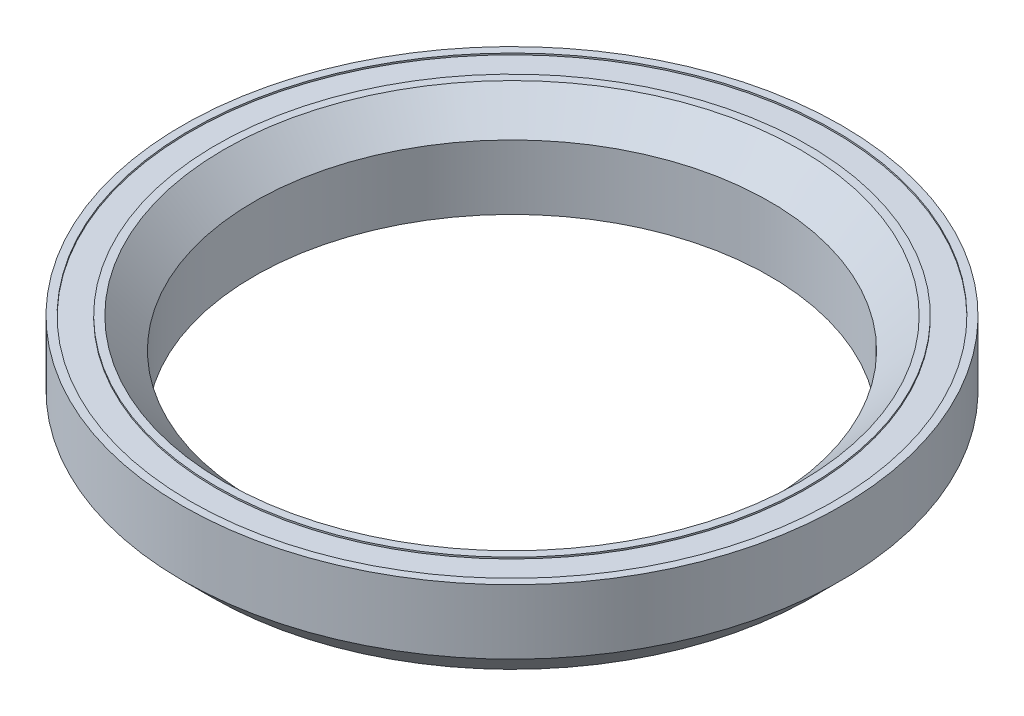
ISO-10303-21;
HEADER;
FILE_DESCRIPTION(('STEP AP214'),'2;1');
FILE_NAME('part.step','',(''),(''),'','','');
FILE_SCHEMA(('AUTOMOTIVE_DESIGN { 1 0 10303 214 1 1 1 1 }'));
ENDSEC;
DATA;
#1=APPLICATION_CONTEXT('core data for automotive mechanical design processes');
#2=APPLICATION_PROTOCOL_DEFINITION('international standard','automotive_design',2000,#1);
#3=PRODUCT_CONTEXT('',#1,'mechanical');
#4=PRODUCT('Part','Part','',(#3));
#5=PRODUCT_RELATED_PRODUCT_CATEGORY('part','',(#4));
#6=PRODUCT_DEFINITION_FORMATION('','',#4);
#7=PRODUCT_DEFINITION_CONTEXT('part definition',#1,'design');
#8=PRODUCT_DEFINITION('design','',#6,#7);
#9=PRODUCT_DEFINITION_SHAPE('','',#8);
#10=(LENGTH_UNIT() NAMED_UNIT(*) SI_UNIT(.MILLI.,.METRE.));
#11=(NAMED_UNIT(*) PLANE_ANGLE_UNIT() SI_UNIT($,.RADIAN.));
#12=(NAMED_UNIT(*) SI_UNIT($,.STERADIAN.) SOLID_ANGLE_UNIT());
#13=UNCERTAINTY_MEASURE_WITH_UNIT(LENGTH_MEASURE(1.E-05),#10,'distance_accuracy_value','');
#14=(GEOMETRIC_REPRESENTATION_CONTEXT(3) GLOBAL_UNCERTAINTY_ASSIGNED_CONTEXT((#13)) GLOBAL_UNIT_ASSIGNED_CONTEXT((#10,
#11,#12)) REPRESENTATION_CONTEXT('',''));
#15=CARTESIAN_POINT('',(0.,0.,0.));
#16=DIRECTION('',(0.,0.,1.));
#17=DIRECTION('',(1.,0.,0.));
#18=AXIS2_PLACEMENT_3D('',#15,#16,#17);
#19=CARTESIAN_POINT('',(0.,0.,16.35));
#20=DIRECTION('',(0.,-1.,0.));
#21=DIRECTION('',(0.,0.,-1.));
#22=AXIS2_PLACEMENT_3D('',#19,#20,#21);
#23=PLANE('',#22);
#24=CARTESIAN_POINT('',(0.,0.,0.));
#25=DIRECTION('',(0.,1.,0.));
#26=DIRECTION('',(0.,0.,1.));
#27=AXIS2_PLACEMENT_3D('',#24,#25,#26);
#28=CIRCLE('',#27,16.35);
#29=CARTESIAN_POINT('',(0.,0.,16.35));
#30=VERTEX_POINT('',#29);
#31=EDGE_CURVE('E54',#30,#30,#28,.T.);
#32=ORIENTED_EDGE('',*,*,#31,.T.);
#33=EDGE_LOOP('',(#32));
#34=FACE_BOUND('',#33,.T.);
#35=CARTESIAN_POINT('',(0.,0.,0.));
#36=DIRECTION('',(0.,-1.,0.));
#37=DIRECTION('',(0.,0.,-1.));
#38=AXIS2_PLACEMENT_3D('',#35,#36,#37);
#39=CIRCLE('',#38,16.85);
#40=CARTESIAN_POINT('',(0.,0.,-16.85));
#41=VERTEX_POINT('',#40);
#42=EDGE_CURVE('E79',#41,#41,#39,.T.);
#43=ORIENTED_EDGE('',*,*,#42,.T.);
#44=EDGE_LOOP('',(#43));
#45=FACE_BOUND('',#44,.T.);
#46=ADVANCED_FACE('F34',(#34,#45),#23,.T.);
#47=CARTESIAN_POINT('',(0.,6.,20.9));
#48=DIRECTION('',(0.,1.,0.));
#49=DIRECTION('',(0.,0.,1.));
#50=AXIS2_PLACEMENT_3D('',#47,#48,#49);
#51=PLANE('',#50);
#52=CARTESIAN_POINT('',(0.,6.,0.));
#53=DIRECTION('',(0.,1.,0.));
#54=DIRECTION('',(0.,0.,1.));
#55=AXIS2_PLACEMENT_3D('',#52,#53,#54);
#56=CIRCLE('',#55,18.26);
#57=CARTESIAN_POINT('',(0.,6.,18.26));
#58=VERTEX_POINT('',#57);
#59=EDGE_CURVE('E45',#58,#58,#56,.T.);
#60=ORIENTED_EDGE('',*,*,#59,.F.);
#61=EDGE_LOOP('',(#60));
#62=FACE_BOUND('',#61,.T.);
#63=CARTESIAN_POINT('',(0.,6.,0.));
#64=DIRECTION('',(0.,1.,0.));
#65=DIRECTION('',(0.,0.,1.));
#66=AXIS2_PLACEMENT_3D('',#63,#64,#65);
#67=CIRCLE('',#66,18.76);
#68=CARTESIAN_POINT('',(0.,6.,18.76));
#69=VERTEX_POINT('',#68);
#70=EDGE_CURVE('E67',#69,#69,#67,.T.);
#71=ORIENTED_EDGE('',*,*,#70,.T.);
#72=EDGE_LOOP('',(#71));
#73=FACE_BOUND('',#72,.T.);
#74=ADVANCED_FACE('F112',(#62,#73),#51,.T.);
#75=CARTESIAN_POINT('',(0.,1.91,0.));
#76=DIRECTION('',(0.,1.,0.));
#77=DIRECTION('',(0.,0.,1.));
#78=AXIS2_PLACEMENT_3D('',#75,#76,#77);
#79=CONICAL_SURFACE('',#78,20.9,0.785398163397447);
#80=CARTESIAN_POINT('',(0.,0.,0.));
#81=DIRECTION('',(0.,1.,0.));
#82=DIRECTION('',(0.,0.,1.));
#83=AXIS2_PLACEMENT_3D('',#80,#81,#82);
#84=CIRCLE('',#83,18.99);
#85=CARTESIAN_POINT('',(0.,0.,18.99));
#86=VERTEX_POINT('',#85);
#87=EDGE_CURVE('E57',#86,#86,#84,.T.);
#88=ORIENTED_EDGE('',*,*,#87,.T.);
#89=EDGE_LOOP('',(#88));
#90=FACE_BOUND('',#89,.T.);
#91=CARTESIAN_POINT('',(0.,1.91,0.));
#92=DIRECTION('',(0.,1.,0.));
#93=DIRECTION('',(0.,0.,1.));
#94=AXIS2_PLACEMENT_3D('',#91,#92,#93);
#95=CIRCLE('',#94,20.9);
#96=CARTESIAN_POINT('',(0.,1.91,20.9));
#97=VERTEX_POINT('',#96);
#98=EDGE_CURVE('E10',#97,#97,#95,.T.);
#99=ORIENTED_EDGE('',*,*,#98,.F.);
#100=EDGE_LOOP('',(#99));
#101=FACE_BOUND('',#100,.T.);
#102=ADVANCED_FACE('F36',(#90,#101),#79,.T.);
#103=CARTESIAN_POINT('',(0.,0.,0.));
#104=DIRECTION('',(0.,1.,0.));
#105=DIRECTION('',(0.,0.,1.));
#106=AXIS2_PLACEMENT_3D('',#103,#104,#105);
#107=CYLINDRICAL_SURFACE('',#106,20.9);
#108=ORIENTED_EDGE('',*,*,#98,.T.);
#109=EDGE_LOOP('',(#108));
#110=FACE_BOUND('',#109,.T.);
#111=CARTESIAN_POINT('',(0.,6.,0.));
#112=DIRECTION('',(0.,1.,0.));
#113=DIRECTION('',(0.,0.,1.));
#114=AXIS2_PLACEMENT_3D('',#111,#112,#113);
#115=CIRCLE('',#114,20.9);
#116=CARTESIAN_POINT('',(0.,6.,20.9));
#117=VERTEX_POINT('',#116);
#118=EDGE_CURVE('E41',#117,#117,#115,.T.);
#119=ORIENTED_EDGE('',*,*,#118,.F.);
#120=EDGE_LOOP('',(#119));
#121=FACE_BOUND('',#120,.T.);
#122=ADVANCED_FACE('F111',(#110,#121),#107,.T.);
#123=CARTESIAN_POINT('',(0.,6.,0.));
#124=DIRECTION('',(0.,1.,0.));
#125=DIRECTION('',(0.,0.,1.));
#126=AXIS2_PLACEMENT_3D('',#123,#124,#125);
#127=CIRCLE('',#126,20.4);
#128=CARTESIAN_POINT('',(0.,6.,20.4));
#129=VERTEX_POINT('',#128);
#130=EDGE_CURVE('E61',#129,#129,#127,.T.);
#131=ORIENTED_EDGE('',*,*,#130,.F.);
#132=EDGE_LOOP('',(#131));
#133=FACE_BOUND('',#132,.T.);
#134=ORIENTED_EDGE('',*,*,#118,.T.);
#135=EDGE_LOOP('',(#134));
#136=FACE_BOUND('',#135,.T.);
#137=ADVANCED_FACE('F117',(#133,#136),#51,.T.);
#138=CARTESIAN_POINT('',(0.,4.09,0.));
#139=DIRECTION('',(0.,1.,0.));
#140=DIRECTION('',(0.,0.,1.));
#141=AXIS2_PLACEMENT_3D('',#138,#139,#140);
#142=CONICAL_SURFACE('',#141,16.35,0.785398163397447);
#143=ORIENTED_EDGE('',*,*,#59,.T.);
#144=EDGE_LOOP('',(#143));
#145=FACE_BOUND('',#144,.T.);
#146=CARTESIAN_POINT('',(0.,4.09,0.));
#147=DIRECTION('',(0.,1.,0.));
#148=DIRECTION('',(0.,0.,1.));
#149=AXIS2_PLACEMENT_3D('',#146,#147,#148);
#150=CIRCLE('',#149,16.35);
#151=CARTESIAN_POINT('',(0.,4.09,16.35));
#152=VERTEX_POINT('',#151);
#153=EDGE_CURVE('E49',#152,#152,#150,.T.);
#154=ORIENTED_EDGE('',*,*,#153,.F.);
#155=EDGE_LOOP('',(#154));
#156=FACE_BOUND('',#155,.T.);
#157=ADVANCED_FACE('F130',(#145,#156),#142,.F.);
#158=CARTESIAN_POINT('',(0.,0.,0.));
#159=DIRECTION('',(0.,1.,0.));
#160=DIRECTION('',(0.,0.,1.));
#161=AXIS2_PLACEMENT_3D('',#158,#159,#160);
#162=CYLINDRICAL_SURFACE('',#161,16.35);
#163=ORIENTED_EDGE('',*,*,#153,.T.);
#164=EDGE_LOOP('',(#163));
#165=FACE_BOUND('',#164,.T.);
#166=ORIENTED_EDGE('',*,*,#31,.F.);
#167=EDGE_LOOP('',(#166));
#168=FACE_BOUND('',#167,.T.);
#169=ADVANCED_FACE('F105',(#165,#168),#162,.F.);
#170=CARTESIAN_POINT('',(0.,0.,0.));
#171=DIRECTION('',(0.,-1.,0.));
#172=DIRECTION('',(0.,0.,-1.));
#173=AXIS2_PLACEMENT_3D('',#170,#171,#172);
#174=CIRCLE('',#173,18.49);
#175=CARTESIAN_POINT('',(0.,0.,-18.49));
#176=VERTEX_POINT('',#175);
#177=EDGE_CURVE('E73',#176,#176,#174,.T.);
#178=ORIENTED_EDGE('',*,*,#177,.F.);
#179=EDGE_LOOP('',(#178));
#180=FACE_BOUND('',#179,.T.);
#181=ORIENTED_EDGE('',*,*,#87,.F.);
#182=EDGE_LOOP('',(#181));
#183=FACE_BOUND('',#182,.T.);
#184=ADVANCED_FACE('F101',(#180,#183),#23,.T.);
#185=CARTESIAN_POINT('',(0.,5.9,0.));
#186=DIRECTION('',(0.,1.,0.));
#187=DIRECTION('',(0.,0.,1.));
#188=AXIS2_PLACEMENT_3D('',#185,#186,#187);
#189=CYLINDRICAL_SURFACE('',#188,20.4);
#190=CARTESIAN_POINT('',(0.,5.9,0.));
#191=DIRECTION('',(0.,1.,0.));
#192=DIRECTION('',(0.,0.,1.));
#193=AXIS2_PLACEMENT_3D('',#190,#191,#192);
#194=CIRCLE('',#193,20.4);
#195=CARTESIAN_POINT('',(0.,5.9,20.4));
#196=VERTEX_POINT('',#195);
#197=EDGE_CURVE('E60',#196,#196,#194,.T.);
#198=ORIENTED_EDGE('',*,*,#197,.F.);
#199=EDGE_LOOP('',(#198));
#200=FACE_BOUND('',#199,.T.);
#201=ORIENTED_EDGE('',*,*,#130,.T.);
#202=EDGE_LOOP('',(#201));
#203=FACE_BOUND('',#202,.T.);
#204=ADVANCED_FACE('F104',(#200,#203),#189,.F.);
#205=CARTESIAN_POINT('',(0.,5.9,0.));
#206=DIRECTION('',(0.,1.,0.));
#207=DIRECTION('',(0.,0.,1.));
#208=AXIS2_PLACEMENT_3D('',#205,#206,#207);
#209=PLANE('',#208);
#210=CARTESIAN_POINT('',(0.,5.9,0.));
#211=DIRECTION('',(0.,1.,0.));
#212=DIRECTION('',(0.,0.,1.));
#213=AXIS2_PLACEMENT_3D('',#210,#211,#212);
#214=CIRCLE('',#213,18.76);
#215=CARTESIAN_POINT('',(0.,5.9,18.76));
#216=VERTEX_POINT('',#215);
#217=EDGE_CURVE('E64',#216,#216,#214,.T.);
#218=ORIENTED_EDGE('',*,*,#217,.F.);
#219=EDGE_LOOP('',(#218));
#220=FACE_BOUND('',#219,.T.);
#221=ORIENTED_EDGE('',*,*,#197,.T.);
#222=EDGE_LOOP('',(#221));
#223=FACE_BOUND('',#222,.T.);
#224=ADVANCED_FACE('F141',(#220,#223),#209,.T.);
#225=CARTESIAN_POINT('',(0.,5.9,0.));
#226=DIRECTION('',(0.,1.,0.));
#227=DIRECTION('',(0.,0.,1.));
#228=AXIS2_PLACEMENT_3D('',#225,#226,#227);
#229=CYLINDRICAL_SURFACE('',#228,18.76);
#230=ORIENTED_EDGE('',*,*,#217,.T.);
#231=EDGE_LOOP('',(#230));
#232=FACE_BOUND('',#231,.T.);
#233=ORIENTED_EDGE('',*,*,#70,.F.);
#234=EDGE_LOOP('',(#233));
#235=FACE_BOUND('',#234,.T.);
#236=ADVANCED_FACE('F97',(#232,#235),#229,.T.);
#237=CARTESIAN_POINT('',(0.,0.1,0.));
#238=DIRECTION('',(0.,-1.,0.));
#239=DIRECTION('',(0.,0.,-1.));
#240=AXIS2_PLACEMENT_3D('',#237,#238,#239);
#241=CYLINDRICAL_SURFACE('',#240,18.49);
#242=CARTESIAN_POINT('',(0.,0.1,0.));
#243=DIRECTION('',(0.,-1.,0.));
#244=DIRECTION('',(0.,0.,-1.));
#245=AXIS2_PLACEMENT_3D('',#242,#243,#244);
#246=CIRCLE('',#245,18.49);
#247=CARTESIAN_POINT('',(0.,0.1,-18.49));
#248=VERTEX_POINT('',#247);
#249=EDGE_CURVE('E70',#248,#248,#246,.T.);
#250=ORIENTED_EDGE('',*,*,#249,.F.);
#251=EDGE_LOOP('',(#250));
#252=FACE_BOUND('',#251,.T.);
#253=ORIENTED_EDGE('',*,*,#177,.T.);
#254=EDGE_LOOP('',(#253));
#255=FACE_BOUND('',#254,.T.);
#256=ADVANCED_FACE('F91',(#252,#255),#241,.F.);
#257=CARTESIAN_POINT('',(0.,0.1,0.));
#258=DIRECTION('',(0.,-1.,0.));
#259=DIRECTION('',(0.,0.,-1.));
#260=AXIS2_PLACEMENT_3D('',#257,#258,#259);
#261=PLANE('',#260);
#262=CARTESIAN_POINT('',(0.,0.1,0.));
#263=DIRECTION('',(0.,-1.,0.));
#264=DIRECTION('',(0.,0.,-1.));
#265=AXIS2_PLACEMENT_3D('',#262,#263,#264);
#266=CIRCLE('',#265,16.85);
#267=CARTESIAN_POINT('',(0.,0.1,-16.85));
#268=VERTEX_POINT('',#267);
#269=EDGE_CURVE('E76',#268,#268,#266,.T.);
#270=ORIENTED_EDGE('',*,*,#269,.F.);
#271=EDGE_LOOP('',(#270));
#272=FACE_BOUND('',#271,.T.);
#273=ORIENTED_EDGE('',*,*,#249,.T.);
#274=EDGE_LOOP('',(#273));
#275=FACE_BOUND('',#274,.T.);
#276=ADVANCED_FACE('F88',(#272,#275),#261,.T.);
#277=CARTESIAN_POINT('',(0.,0.1,0.));
#278=DIRECTION('',(0.,-1.,0.));
#279=DIRECTION('',(0.,0.,-1.));
#280=AXIS2_PLACEMENT_3D('',#277,#278,#279);
#281=CYLINDRICAL_SURFACE('',#280,16.85);
#282=ORIENTED_EDGE('',*,*,#269,.T.);
#283=EDGE_LOOP('',(#282));
#284=FACE_BOUND('',#283,.T.);
#285=ORIENTED_EDGE('',*,*,#42,.F.);
#286=EDGE_LOOP('',(#285));
#287=FACE_BOUND('',#286,.T.);
#288=ADVANCED_FACE('F85',(#284,#287),#281,.T.);
#289=CLOSED_SHELL('',(#46,#74,#102,#122,#137,#157,#169,#184,#204,#224,#236,#256,#276,#288));
#290=MANIFOLD_SOLID_BREP('B2',#289);
#291=ADVANCED_BREP_SHAPE_REPRESENTATION('',(#18,#290),#14);
#292=SHAPE_DEFINITION_REPRESENTATION(#9,#291);
ENDSEC;
END-ISO-10303-21;
